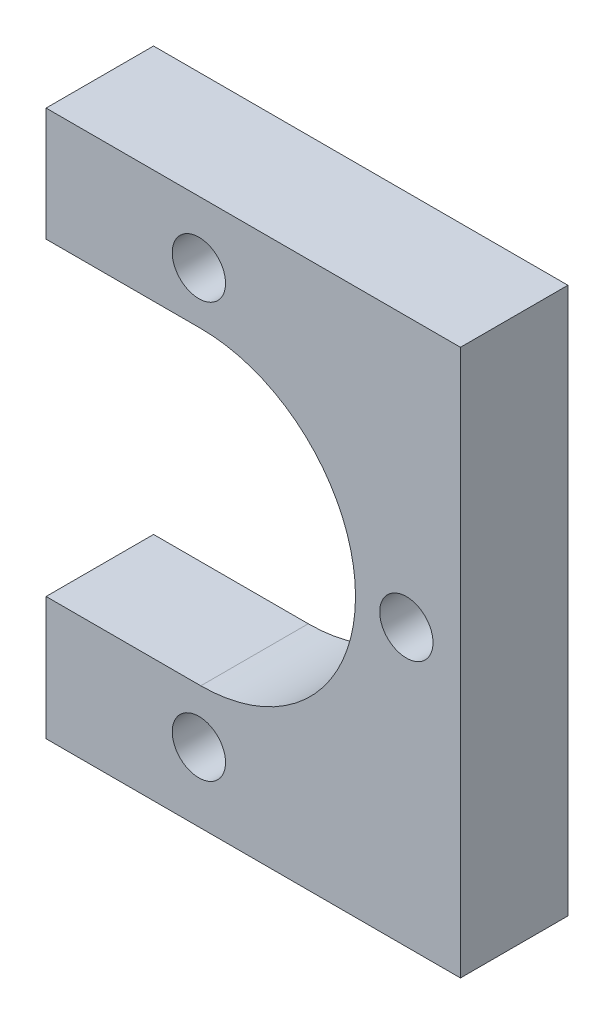
ISO-10303-21;
HEADER;
FILE_DESCRIPTION(('STEP AP214'),'2;1');
FILE_NAME('part.step','',(''),(''),'','','');
FILE_SCHEMA(('AUTOMOTIVE_DESIGN { 1 0 10303 214 1 1 1 1 }'));
ENDSEC;
DATA;
#1=APPLICATION_CONTEXT('core data for automotive mechanical design processes');
#2=APPLICATION_PROTOCOL_DEFINITION('international standard','automotive_design',2000,#1);
#3=PRODUCT_CONTEXT('',#1,'mechanical');
#4=PRODUCT('Part','Part','',(#3));
#5=PRODUCT_RELATED_PRODUCT_CATEGORY('part','',(#4));
#6=PRODUCT_DEFINITION_FORMATION('','',#4);
#7=PRODUCT_DEFINITION_CONTEXT('part definition',#1,'design');
#8=PRODUCT_DEFINITION('design','',#6,#7);
#9=PRODUCT_DEFINITION_SHAPE('','',#8);
#10=(LENGTH_UNIT() NAMED_UNIT(*) SI_UNIT(.MILLI.,.METRE.));
#11=(NAMED_UNIT(*) PLANE_ANGLE_UNIT() SI_UNIT($,.RADIAN.));
#12=(NAMED_UNIT(*) SI_UNIT($,.STERADIAN.) SOLID_ANGLE_UNIT());
#13=UNCERTAINTY_MEASURE_WITH_UNIT(LENGTH_MEASURE(1.E-05),#10,'distance_accuracy_value','');
#14=(GEOMETRIC_REPRESENTATION_CONTEXT(3) GLOBAL_UNCERTAINTY_ASSIGNED_CONTEXT((#13)) GLOBAL_UNIT_ASSIGNED_CONTEXT((#10,
#11,#12)) REPRESENTATION_CONTEXT('',''));
#15=CARTESIAN_POINT('',(0.,0.,0.));
#16=DIRECTION('',(0.,0.,1.));
#17=DIRECTION('',(1.,0.,0.));
#18=AXIS2_PLACEMENT_3D('',#15,#16,#17);
#19=CARTESIAN_POINT('',(-26.91,-28.735,11.11));
#20=DIRECTION('',(0.,1.,0.));
#21=DIRECTION('',(0.,0.,1.));
#22=AXIS2_PLACEMENT_3D('',#19,#20,#21);
#23=PLANE('',#22);
#24=DIRECTION('',(-1.,0.,0.));
#25=VECTOR('',#24,1.);
#26=CARTESIAN_POINT('',(26.91,-28.735,11.11));
#27=LINE('',#26,#25);
#28=CARTESIAN_POINT('',(26.91,-28.735,11.11));
#29=VERTEX_POINT('',#28);
#30=CARTESIAN_POINT('',(-15.9290748365572,-28.735,11.11));
#31=VERTEX_POINT('',#30);
#32=EDGE_CURVE('E181',#29,#31,#27,.T.);
#33=ORIENTED_EDGE('',*,*,#32,.F.);
#34=DIRECTION('',(0.,0.,-1.));
#35=VECTOR('',#34,1.);
#36=CARTESIAN_POINT('',(26.91,-28.735,11.11));
#37=LINE('',#36,#35);
#38=CARTESIAN_POINT('',(26.91,-28.735,22.22));
#39=VERTEX_POINT('',#38);
#40=EDGE_CURVE('E11',#39,#29,#37,.T.);
#41=ORIENTED_EDGE('',*,*,#40,.F.);
#42=DIRECTION('',(1.,0.,0.));
#43=VECTOR('',#42,1.);
#44=CARTESIAN_POINT('',(0.,-28.735,22.22));
#45=LINE('',#44,#43);
#46=CARTESIAN_POINT('',(-15.9290748365572,-28.735,22.22));
#47=VERTEX_POINT('',#46);
#48=EDGE_CURVE('E128',#47,#39,#45,.T.);
#49=ORIENTED_EDGE('',*,*,#48,.F.);
#50=DIRECTION('',(0.,0.,-1.));
#51=VECTOR('',#50,1.);
#52=CARTESIAN_POINT('',(-15.9290748365572,-28.735,22.22));
#53=LINE('',#52,#51);
#54=EDGE_CURVE('E146',#47,#31,#53,.T.);
#55=ORIENTED_EDGE('',*,*,#54,.T.);
#56=EDGE_LOOP('',(#33,#41,#49,#55));
#57=FACE_BOUND('',#56,.T.);
#58=ADVANCED_FACE('F34',(#57),#23,.F.);
#59=CARTESIAN_POINT('',(26.91,28.735,11.11));
#60=DIRECTION('',(-1.,0.,0.));
#61=DIRECTION('',(0.,-1.,0.));
#62=AXIS2_PLACEMENT_3D('',#59,#60,#61);
#63=PLANE('',#62);
#64=DIRECTION('',(0.,-1.,0.));
#65=VECTOR('',#64,1.);
#66=CARTESIAN_POINT('',(26.91,28.735,11.11));
#67=LINE('',#66,#65);
#68=CARTESIAN_POINT('',(26.91,27.735,11.11));
#69=VERTEX_POINT('',#68);
#70=EDGE_CURVE('E176',#69,#29,#67,.T.);
#71=ORIENTED_EDGE('',*,*,#70,.F.);
#72=DIRECTION('',(0.,0.,-1.));
#73=VECTOR('',#72,1.);
#74=CARTESIAN_POINT('',(26.91,27.735,65.0707448342751));
#75=LINE('',#74,#73);
#76=CARTESIAN_POINT('',(26.91,27.735,22.22));
#77=VERTEX_POINT('',#76);
#78=EDGE_CURVE('E51',#77,#69,#75,.T.);
#79=ORIENTED_EDGE('',*,*,#78,.F.);
#80=DIRECTION('',(0.,1.,0.));
#81=VECTOR('',#80,1.);
#82=CARTESIAN_POINT('',(26.91,-61.3838326942962,22.22));
#83=LINE('',#82,#81);
#84=EDGE_CURVE('E118',#39,#77,#83,.T.);
#85=ORIENTED_EDGE('',*,*,#84,.F.);
#86=ORIENTED_EDGE('',*,*,#40,.T.);
#87=EDGE_LOOP('',(#71,#79,#85,#86));
#88=FACE_BOUND('',#87,.T.);
#89=ADVANCED_FACE('F179',(#88),#63,.F.);
#90=CARTESIAN_POINT('',(0.0659251634427538,0.,22.22));
#91=DIRECTION('',(0.,0.,-1.));
#92=DIRECTION('',(-1.,0.,0.));
#93=AXIS2_PLACEMENT_3D('',#90,#91,#92);
#94=CYLINDRICAL_SURFACE('',#93,15.995);
#95=CARTESIAN_POINT('',(0.0659251634427538,0.,11.11));
#96=DIRECTION('',(0.,0.,1.));
#97=DIRECTION('',(1.,0.,0.));
#98=AXIS2_PLACEMENT_3D('',#95,#96,#97);
#99=CIRCLE('',#98,15.995);
#100=CARTESIAN_POINT('',(0.0659251634427538,-15.995,11.11));
#101=VERTEX_POINT('',#100);
#102=CARTESIAN_POINT('',(0.0659251634427538,15.995,11.11));
#103=VERTEX_POINT('',#102);
#104=EDGE_CURVE('E59',#101,#103,#99,.T.);
#105=ORIENTED_EDGE('',*,*,#104,.F.);
#106=DIRECTION('',(0.,0.,-1.));
#107=VECTOR('',#106,1.);
#108=CARTESIAN_POINT('',(0.0659251634427538,-15.995,22.22));
#109=LINE('',#108,#107);
#110=CARTESIAN_POINT('',(0.0659251634427538,-15.995,22.22));
#111=VERTEX_POINT('',#110);
#112=EDGE_CURVE('E43',#111,#101,#109,.T.);
#113=ORIENTED_EDGE('',*,*,#112,.F.);
#114=CARTESIAN_POINT('',(0.0659251634427538,0.,22.22));
#115=DIRECTION('',(0.,0.,1.));
#116=DIRECTION('',(1.,0.,0.));
#117=AXIS2_PLACEMENT_3D('',#114,#115,#116);
#118=CIRCLE('',#117,15.995);
#119=CARTESIAN_POINT('',(0.0659251634427538,15.995,22.22));
#120=VERTEX_POINT('',#119);
#121=EDGE_CURVE('E170',#111,#120,#118,.T.);
#122=ORIENTED_EDGE('',*,*,#121,.T.);
#123=DIRECTION('',(0.,0.,-1.));
#124=VECTOR('',#123,1.);
#125=CARTESIAN_POINT('',(0.0659251634427538,15.995,22.22));
#126=LINE('',#125,#124);
#127=EDGE_CURVE('E126',#120,#103,#126,.T.);
#128=ORIENTED_EDGE('',*,*,#127,.T.);
#129=EDGE_LOOP('',(#105,#113,#122,#128));
#130=FACE_BOUND('',#129,.T.);
#131=ADVANCED_FACE('F169',(#130),#94,.F.);
#132=CARTESIAN_POINT('',(0.,-15.995,22.22));
#133=DIRECTION('',(0.,-1.,0.));
#134=DIRECTION('',(0.,0.,-1.));
#135=AXIS2_PLACEMENT_3D('',#132,#133,#134);
#136=PLANE('',#135);
#137=DIRECTION('',(-1.,0.,0.));
#138=VECTOR('',#137,1.);
#139=CARTESIAN_POINT('',(0.,-15.995,11.11));
#140=LINE('',#139,#138);
#141=CARTESIAN_POINT('',(-15.9290748365572,-15.995,11.11));
#142=VERTEX_POINT('',#141);
#143=EDGE_CURVE('E133',#101,#142,#140,.T.);
#144=ORIENTED_EDGE('',*,*,#143,.T.);
#145=DIRECTION('',(0.,0.,-1.));
#146=VECTOR('',#145,1.);
#147=CARTESIAN_POINT('',(-15.9290748365572,-15.995,22.22));
#148=LINE('',#147,#146);
#149=CARTESIAN_POINT('',(-15.9290748365572,-15.995,22.22));
#150=VERTEX_POINT('',#149);
#151=EDGE_CURVE('E148',#150,#142,#148,.T.);
#152=ORIENTED_EDGE('',*,*,#151,.F.);
#153=DIRECTION('',(-1.,0.,0.));
#154=VECTOR('',#153,1.);
#155=CARTESIAN_POINT('',(0.,-15.995,22.22));
#156=LINE('',#155,#154);
#157=EDGE_CURVE('E165',#111,#150,#156,.T.);
#158=ORIENTED_EDGE('',*,*,#157,.F.);
#159=ORIENTED_EDGE('',*,*,#112,.T.);
#160=EDGE_LOOP('',(#144,#152,#158,#159));
#161=FACE_BOUND('',#160,.T.);
#162=ADVANCED_FACE('F163',(#161),#136,.F.);
#163=CARTESIAN_POINT('',(-15.9290748365572,-61.3838326942962,22.22));
#164=DIRECTION('',(1.,0.,0.));
#165=DIRECTION('',(0.,0.,-1.));
#166=AXIS2_PLACEMENT_3D('',#163,#164,#165);
#167=PLANE('',#166);
#168=DIRECTION('',(0.,-1.,0.));
#169=VECTOR('',#168,1.);
#170=CARTESIAN_POINT('',(-15.9290748365572,-61.3838326942962,11.11));
#171=LINE('',#170,#169);
#172=EDGE_CURVE('E137',#142,#31,#171,.T.);
#173=ORIENTED_EDGE('',*,*,#172,.T.);
#174=ORIENTED_EDGE('',*,*,#54,.F.);
#175=DIRECTION('',(0.,-1.,0.));
#176=VECTOR('',#175,1.);
#177=CARTESIAN_POINT('',(-15.9290748365572,-61.3838326942962,22.22));
#178=LINE('',#177,#176);
#179=EDGE_CURVE('E205',#150,#47,#178,.T.);
#180=ORIENTED_EDGE('',*,*,#179,.F.);
#181=ORIENTED_EDGE('',*,*,#151,.T.);
#182=EDGE_LOOP('',(#173,#174,#180,#181));
#183=FACE_BOUND('',#182,.T.);
#184=ADVANCED_FACE('F208',(#183),#167,.F.);
#185=CARTESIAN_POINT('',(-15.9290748365572,-61.3838326942962,22.22));
#186=DIRECTION('',(1.,0.,0.));
#187=DIRECTION('',(0.,0.,-1.));
#188=AXIS2_PLACEMENT_3D('',#185,#186,#187);
#189=PLANE('',#188);
#190=DIRECTION('',(0.,-1.,0.));
#191=VECTOR('',#190,1.);
#192=CARTESIAN_POINT('',(-15.9290748365572,-61.3838326942962,22.22));
#193=LINE('',#192,#191);
#194=CARTESIAN_POINT('',(-15.9290748365572,27.735,22.22));
#195=VERTEX_POINT('',#194);
#196=CARTESIAN_POINT('',(-15.9290748365572,15.995,22.22));
#197=VERTEX_POINT('',#196);
#198=EDGE_CURVE('E114',#195,#197,#193,.T.);
#199=ORIENTED_EDGE('',*,*,#198,.F.);
#200=DIRECTION('',(0.,0.,-1.));
#201=VECTOR('',#200,1.);
#202=CARTESIAN_POINT('',(-15.9290748365572,27.735,65.0707448342751));
#203=LINE('',#202,#201);
#204=CARTESIAN_POINT('',(-15.9290748365572,27.735,11.11));
#205=VERTEX_POINT('',#204);
#206=EDGE_CURVE('E100',#195,#205,#203,.T.);
#207=ORIENTED_EDGE('',*,*,#206,.T.);
#208=DIRECTION('',(0.,-1.,0.));
#209=VECTOR('',#208,1.);
#210=CARTESIAN_POINT('',(-15.9290748365572,-61.3838326942962,11.11));
#211=LINE('',#210,#209);
#212=CARTESIAN_POINT('',(-15.9290748365572,15.995,11.11));
#213=VERTEX_POINT('',#212);
#214=EDGE_CURVE('E37',#205,#213,#211,.T.);
#215=ORIENTED_EDGE('',*,*,#214,.T.);
#216=DIRECTION('',(0.,0.,-1.));
#217=VECTOR('',#216,1.);
#218=CARTESIAN_POINT('',(-15.9290748365572,15.995,22.22));
#219=LINE('',#218,#217);
#220=EDGE_CURVE('E122',#197,#213,#219,.T.);
#221=ORIENTED_EDGE('',*,*,#220,.F.);
#222=EDGE_LOOP('',(#199,#207,#215,#221));
#223=FACE_BOUND('',#222,.T.);
#224=ADVANCED_FACE('F120',(#223),#189,.F.);
#225=CARTESIAN_POINT('',(0.,15.995,22.22));
#226=DIRECTION('',(0.,-1.,0.));
#227=DIRECTION('',(0.,0.,-1.));
#228=AXIS2_PLACEMENT_3D('',#225,#226,#227);
#229=PLANE('',#228);
#230=DIRECTION('',(-1.,0.,0.));
#231=VECTOR('',#230,1.);
#232=CARTESIAN_POINT('',(0.,15.995,11.11));
#233=LINE('',#232,#231);
#234=EDGE_CURVE('E140',#103,#213,#233,.T.);
#235=ORIENTED_EDGE('',*,*,#234,.F.);
#236=ORIENTED_EDGE('',*,*,#127,.F.);
#237=DIRECTION('',(-1.,0.,0.));
#238=VECTOR('',#237,1.);
#239=CARTESIAN_POINT('',(0.,15.995,22.22));
#240=LINE('',#239,#238);
#241=EDGE_CURVE('E124',#120,#197,#240,.T.);
#242=ORIENTED_EDGE('',*,*,#241,.T.);
#243=ORIENTED_EDGE('',*,*,#220,.T.);
#244=EDGE_LOOP('',(#235,#236,#242,#243));
#245=FACE_BOUND('',#244,.T.);
#246=ADVANCED_FACE('F171',(#245),#229,.T.);
#247=CARTESIAN_POINT('',(0.,-61.3838326942962,22.22));
#248=DIRECTION('',(0.,0.,1.));
#249=DIRECTION('',(1.,0.,0.));
#250=AXIS2_PLACEMENT_3D('',#247,#248,#249);
#251=PLANE('',#250);
#252=DIRECTION('',(-1.,0.,0.));
#253=VECTOR('',#252,1.);
#254=CARTESIAN_POINT('',(26.91,27.735,22.22));
#255=LINE('',#254,#253);
#256=EDGE_CURVE('E103',#77,#195,#255,.T.);
#257=ORIENTED_EDGE('',*,*,#256,.T.);
#258=ORIENTED_EDGE('',*,*,#198,.T.);
#259=ORIENTED_EDGE('',*,*,#241,.F.);
#260=ORIENTED_EDGE('',*,*,#121,.F.);
#261=ORIENTED_EDGE('',*,*,#157,.T.);
#262=ORIENTED_EDGE('',*,*,#179,.T.);
#263=ORIENTED_EDGE('',*,*,#48,.T.);
#264=ORIENTED_EDGE('',*,*,#84,.T.);
#265=EDGE_LOOP('',(#257,#258,#259,#260,#261,#262,#263,#264));
#266=FACE_BOUND('',#265,.T.);
#267=CARTESIAN_POINT('',(-0.131863071869156,21.3181495506226,22.22));
#268=DIRECTION('',(0.,0.,1.));
#269=DIRECTION('',(1.,0.,0.));
#270=AXIS2_PLACEMENT_3D('',#267,#268,#269);
#271=CIRCLE('',#270,2.755);
#272=CARTESIAN_POINT('',(2.62313692813084,21.3181495506226,22.22));
#273=VERTEX_POINT('',#272);
#274=EDGE_CURVE('E196',#273,#273,#271,.T.);
#275=ORIENTED_EDGE('',*,*,#274,.F.);
#276=EDGE_LOOP('',(#275));
#277=FACE_BOUND('',#276,.T.);
#278=CARTESIAN_POINT('',(-0.131863071869457,-21.5818504493774,22.22));
#279=DIRECTION('',(0.,0.,1.));
#280=DIRECTION('',(1.,0.,0.));
#281=AXIS2_PLACEMENT_3D('',#278,#279,#280);
#282=CIRCLE('',#281,2.755);
#283=CARTESIAN_POINT('',(2.62313692813054,-21.5818504493774,22.22));
#284=VERTEX_POINT('',#283);
#285=EDGE_CURVE('E199',#284,#284,#282,.T.);
#286=ORIENTED_EDGE('',*,*,#285,.F.);
#287=EDGE_LOOP('',(#286));
#288=FACE_BOUND('',#287,.T.);
#289=CARTESIAN_POINT('',(21.3181369281306,-0.131850449377435,22.22));
#290=DIRECTION('',(0.,0.,1.));
#291=DIRECTION('',(1.,0.,0.));
#292=AXIS2_PLACEMENT_3D('',#289,#290,#291);
#293=CIRCLE('',#292,2.755);
#294=CARTESIAN_POINT('',(24.0731369281306,-0.131850449377435,22.22));
#295=VERTEX_POINT('',#294);
#296=EDGE_CURVE('E134',#295,#295,#293,.T.);
#297=ORIENTED_EDGE('',*,*,#296,.F.);
#298=EDGE_LOOP('',(#297));
#299=FACE_BOUND('',#298,.T.);
#300=ADVANCED_FACE('F111',(#266,#277,#288,#299),#251,.T.);
#301=CARTESIAN_POINT('',(21.3181369281306,-0.131850449377435,11.11));
#302=DIRECTION('',(0.,0.,1.));
#303=DIRECTION('',(1.,0.,0.));
#304=AXIS2_PLACEMENT_3D('',#301,#302,#303);
#305=CYLINDRICAL_SURFACE('',#304,2.755);
#306=CARTESIAN_POINT('',(21.3181369281306,-0.131850449377435,11.11));
#307=DIRECTION('',(0.,0.,-1.));
#308=DIRECTION('',(-1.,0.,0.));
#309=AXIS2_PLACEMENT_3D('',#306,#307,#308);
#310=CIRCLE('',#309,2.755);
#311=CARTESIAN_POINT('',(18.5631369281306,-0.131850449377435,11.11));
#312=VERTEX_POINT('',#311);
#313=EDGE_CURVE('E193',#312,#312,#310,.F.);
#314=ORIENTED_EDGE('',*,*,#313,.F.);
#315=EDGE_LOOP('',(#314));
#316=FACE_BOUND('',#315,.T.);
#317=ORIENTED_EDGE('',*,*,#296,.T.);
#318=EDGE_LOOP('',(#317));
#319=FACE_BOUND('',#318,.T.);
#320=ADVANCED_FACE('F276',(#316,#319),#305,.F.);
#321=CARTESIAN_POINT('',(-0.131863071869457,-21.5818504493774,11.11));
#322=DIRECTION('',(0.,0.,1.));
#323=DIRECTION('',(1.,0.,0.));
#324=AXIS2_PLACEMENT_3D('',#321,#322,#323);
#325=CYLINDRICAL_SURFACE('',#324,2.755);
#326=CARTESIAN_POINT('',(-0.131863071869457,-21.5818504493774,11.11));
#327=DIRECTION('',(0.,0.,-1.));
#328=DIRECTION('',(-1.,0.,0.));
#329=AXIS2_PLACEMENT_3D('',#326,#327,#328);
#330=CIRCLE('',#329,2.755);
#331=CARTESIAN_POINT('',(-2.88686307186946,-21.5818504493774,11.11));
#332=VERTEX_POINT('',#331);
#333=EDGE_CURVE('E184',#332,#332,#330,.F.);
#334=ORIENTED_EDGE('',*,*,#333,.F.);
#335=EDGE_LOOP('',(#334));
#336=FACE_BOUND('',#335,.T.);
#337=ORIENTED_EDGE('',*,*,#285,.T.);
#338=EDGE_LOOP('',(#337));
#339=FACE_BOUND('',#338,.T.);
#340=ADVANCED_FACE('F305',(#336,#339),#325,.F.);
#341=CARTESIAN_POINT('',(-0.131863071869156,21.3181495506226,11.11));
#342=DIRECTION('',(0.,0.,1.));
#343=DIRECTION('',(1.,0.,0.));
#344=AXIS2_PLACEMENT_3D('',#341,#342,#343);
#345=CYLINDRICAL_SURFACE('',#344,2.755);
#346=CARTESIAN_POINT('',(-0.131863071869156,21.3181495506226,11.11));
#347=DIRECTION('',(0.,0.,-1.));
#348=DIRECTION('',(-1.,0.,0.));
#349=AXIS2_PLACEMENT_3D('',#346,#347,#348);
#350=CIRCLE('',#349,2.755);
#351=CARTESIAN_POINT('',(-2.88686307186915,21.3181495506226,11.11));
#352=VERTEX_POINT('',#351);
#353=EDGE_CURVE('E180',#352,#352,#350,.F.);
#354=ORIENTED_EDGE('',*,*,#353,.F.);
#355=EDGE_LOOP('',(#354));
#356=FACE_BOUND('',#355,.T.);
#357=ORIENTED_EDGE('',*,*,#274,.T.);
#358=EDGE_LOOP('',(#357));
#359=FACE_BOUND('',#358,.T.);
#360=ADVANCED_FACE('F286',(#356,#359),#345,.F.);
#361=CARTESIAN_POINT('',(-26.91,-28.735,11.11));
#362=DIRECTION('',(0.,0.,-1.));
#363=DIRECTION('',(-1.,0.,0.));
#364=AXIS2_PLACEMENT_3D('',#361,#362,#363);
#365=PLANE('',#364);
#366=DIRECTION('',(-1.,0.,0.));
#367=VECTOR('',#366,1.);
#368=CARTESIAN_POINT('',(26.91,27.735,11.11));
#369=LINE('',#368,#367);
#370=EDGE_CURVE('E104',#69,#205,#369,.T.);
#371=ORIENTED_EDGE('',*,*,#370,.F.);
#372=ORIENTED_EDGE('',*,*,#70,.T.);
#373=ORIENTED_EDGE('',*,*,#32,.T.);
#374=ORIENTED_EDGE('',*,*,#172,.F.);
#375=ORIENTED_EDGE('',*,*,#143,.F.);
#376=ORIENTED_EDGE('',*,*,#104,.T.);
#377=ORIENTED_EDGE('',*,*,#234,.T.);
#378=ORIENTED_EDGE('',*,*,#214,.F.);
#379=EDGE_LOOP('',(#371,#372,#373,#374,#375,#376,#377,#378));
#380=FACE_BOUND('',#379,.T.);
#381=ORIENTED_EDGE('',*,*,#313,.T.);
#382=EDGE_LOOP('',(#381));
#383=FACE_BOUND('',#382,.T.);
#384=ORIENTED_EDGE('',*,*,#353,.T.);
#385=EDGE_LOOP('',(#384));
#386=FACE_BOUND('',#385,.T.);
#387=ORIENTED_EDGE('',*,*,#333,.T.);
#388=EDGE_LOOP('',(#387));
#389=FACE_BOUND('',#388,.T.);
#390=ADVANCED_FACE('F173',(#380,#383,#386,#389),#365,.T.);
#391=CARTESIAN_POINT('',(26.91,27.735,65.0707448342751));
#392=DIRECTION('',(0.,-1.,0.));
#393=DIRECTION('',(0.,0.,-1.));
#394=AXIS2_PLACEMENT_3D('',#391,#392,#393);
#395=PLANE('',#394);
#396=ORIENTED_EDGE('',*,*,#78,.T.);
#397=ORIENTED_EDGE('',*,*,#370,.T.);
#398=ORIENTED_EDGE('',*,*,#206,.F.);
#399=ORIENTED_EDGE('',*,*,#256,.F.);
#400=EDGE_LOOP('',(#396,#397,#398,#399));
#401=FACE_BOUND('',#400,.T.);
#402=ADVANCED_FACE('F102',(#401),#395,.F.);
#403=CLOSED_SHELL('',(#58,#89,#131,#162,#184,#224,#246,#300,#320,#340,#360,#390,#402));
#404=MANIFOLD_SOLID_BREP('B2',#403);
#405=ADVANCED_BREP_SHAPE_REPRESENTATION('',(#18,#404),#14);
#406=SHAPE_DEFINITION_REPRESENTATION(#9,#405);
ENDSEC;
END-ISO-10303-21;
